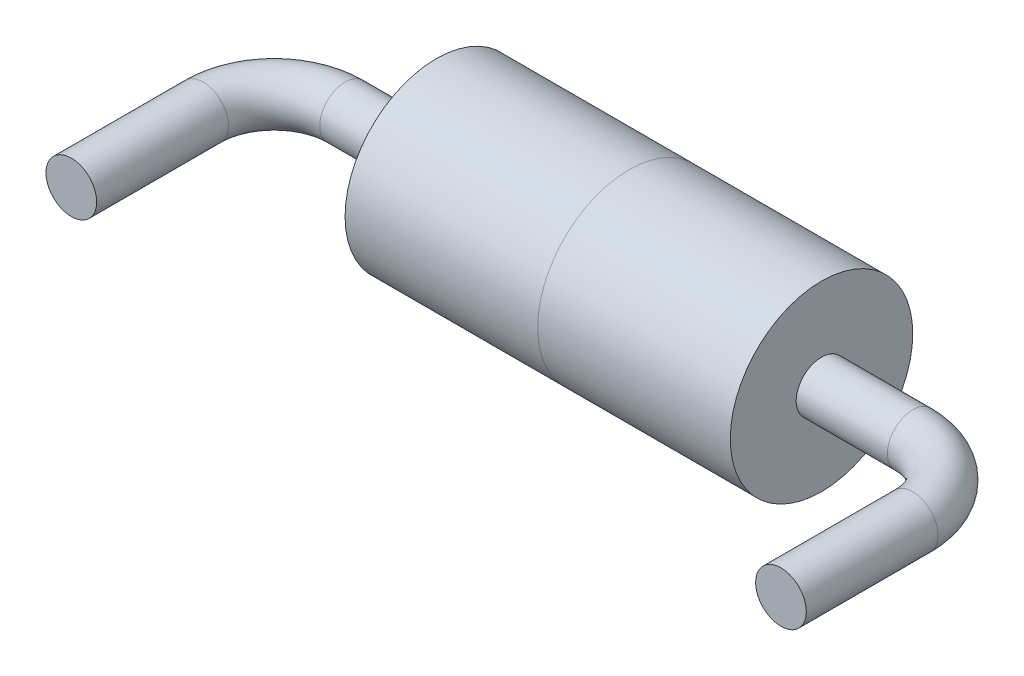
ISO-10303-21;
HEADER;
FILE_DESCRIPTION(('STEP AP214'),'2;1');
FILE_NAME('part.step','',(''),(''),'','','');
FILE_SCHEMA(('AUTOMOTIVE_DESIGN { 1 0 10303 214 1 1 1 1 }'));
ENDSEC;
DATA;
#1=APPLICATION_CONTEXT('core data for automotive mechanical design processes');
#2=APPLICATION_PROTOCOL_DEFINITION('international standard','automotive_design',2000,#1);
#3=PRODUCT_CONTEXT('',#1,'mechanical');
#4=PRODUCT('Part','Part','',(#3));
#5=PRODUCT_RELATED_PRODUCT_CATEGORY('part','',(#4));
#6=PRODUCT_DEFINITION_FORMATION('','',#4);
#7=PRODUCT_DEFINITION_CONTEXT('part definition',#1,'design');
#8=PRODUCT_DEFINITION('design','',#6,#7);
#9=PRODUCT_DEFINITION_SHAPE('','',#8);
#10=(LENGTH_UNIT() NAMED_UNIT(*) SI_UNIT(.MILLI.,.METRE.));
#11=(NAMED_UNIT(*) PLANE_ANGLE_UNIT() SI_UNIT($,.RADIAN.));
#12=(NAMED_UNIT(*) SI_UNIT($,.STERADIAN.) SOLID_ANGLE_UNIT());
#13=UNCERTAINTY_MEASURE_WITH_UNIT(LENGTH_MEASURE(1.E-05),#10,'distance_accuracy_value','');
#14=(GEOMETRIC_REPRESENTATION_CONTEXT(3) GLOBAL_UNCERTAINTY_ASSIGNED_CONTEXT((#13)) GLOBAL_UNIT_ASSIGNED_CONTEXT((#10,
#11,#12)) REPRESENTATION_CONTEXT('',''));
#15=CARTESIAN_POINT('',(0.,0.,0.));
#16=DIRECTION('',(0.,0.,1.));
#17=DIRECTION('',(1.,0.,0.));
#18=AXIS2_PLACEMENT_3D('',#15,#16,#17);
#19=CARTESIAN_POINT('',(-0.700000000000004,0.,0.));
#20=DIRECTION('',(-1.,0.,0.));
#21=DIRECTION('',(0.,0.,1.));
#22=AXIS2_PLACEMENT_3D('',#19,#20,#21);
#23=CYLINDRICAL_SURFACE('',#22,0.25);
#24=CARTESIAN_POINT('',(-6.29999999999999,0.,0.));
#25=DIRECTION('',(1.,0.,0.));
#26=DIRECTION('',(0.,0.,-1.));
#27=AXIS2_PLACEMENT_3D('',#24,#25,#26);
#28=CIRCLE('',#27,0.25);
#29=CARTESIAN_POINT('',(-6.29999999999999,0.,-0.249999999999999));
#30=VERTEX_POINT('',#29);
#31=EDGE_CURVE('E81',#30,#30,#28,.T.);
#32=ORIENTED_EDGE('',*,*,#31,.T.);
#33=EDGE_LOOP('',(#32));
#34=FACE_BOUND('',#33,.T.);
#35=CARTESIAN_POINT('',(-5.40000000000001,0.,0.));
#36=DIRECTION('',(1.,0.,0.));
#37=DIRECTION('',(0.,0.,-1.));
#38=AXIS2_PLACEMENT_3D('',#35,#36,#37);
#39=CIRCLE('',#38,0.25);
#40=CARTESIAN_POINT('',(-5.40000000000001,0.,-0.249999999999999));
#41=VERTEX_POINT('',#40);
#42=EDGE_CURVE('E11',#41,#41,#39,.T.);
#43=ORIENTED_EDGE('',*,*,#42,.F.);
#44=EDGE_LOOP('',(#43));
#45=FACE_BOUND('',#44,.T.);
#46=ADVANCED_FACE('F37',(#34,#45),#23,.T.);
#47=CARTESIAN_POINT('',(-7.,0.,2.));
#48=DIRECTION('',(0.,0.,-1.));
#49=DIRECTION('',(-1.,0.,0.));
#50=AXIS2_PLACEMENT_3D('',#47,#48,#49);
#51=PLANE('',#50);
#52=CARTESIAN_POINT('',(-7.,0.,2.));
#53=DIRECTION('',(0.,0.,-1.));
#54=DIRECTION('',(-1.,0.,0.));
#55=AXIS2_PLACEMENT_3D('',#52,#53,#54);
#56=CIRCLE('',#55,0.25);
#57=CARTESIAN_POINT('',(-7.25,0.,2.));
#58=VERTEX_POINT('',#57);
#59=EDGE_CURVE('E45',#58,#58,#56,.T.);
#60=ORIENTED_EDGE('',*,*,#59,.F.);
#61=EDGE_LOOP('',(#60));
#62=FACE_BOUND('',#61,.T.);
#63=ADVANCED_FACE('F102',(#62),#51,.F.);
#64=CARTESIAN_POINT('',(-6.3,0.,0.700000000000001));
#65=DIRECTION('',(0.,1.,0.));
#66=DIRECTION('',(0.,0.,1.));
#67=AXIS2_PLACEMENT_3D('',#64,#65,#66);
#68=TOROIDAL_SURFACE('',#67,0.7,0.25);
#69=CARTESIAN_POINT('',(-7.,0.,0.700000000000005));
#70=DIRECTION('',(0.,0.,-1.));
#71=DIRECTION('',(-1.,0.,0.));
#72=AXIS2_PLACEMENT_3D('',#69,#70,#71);
#73=CIRCLE('',#72,0.25);
#74=CARTESIAN_POINT('',(-7.25,0.,0.700000000000006));
#75=VERTEX_POINT('',#74);
#76=EDGE_CURVE('E84',#75,#75,#73,.T.);
#77=CARTESIAN_POINT('',(-6.3,0.,0.700000000000001));
#78=DIRECTION('',(0.,1.,0.));
#79=DIRECTION('',(0.,0.,1.));
#80=AXIS2_PLACEMENT_3D('',#77,#78,#79);
#81=CIRCLE('',#80,0.95);
#82=EDGE_CURVE('',#30,#75,#81,.T.);
#83=ORIENTED_EDGE('',*,*,#31,.F.);
#84=ORIENTED_EDGE('',*,*,#76,.T.);
#85=ORIENTED_EDGE('',*,*,#82,.T.);
#86=ORIENTED_EDGE('',*,*,#82,.F.);
#87=EDGE_LOOP('',(#83,#85,#84,#86));
#88=FACE_BOUND('',#87,.T.);
#89=ADVANCED_FACE('F89',(#88),#68,.T.);
#90=CARTESIAN_POINT('',(-7.,0.,0.700000000000005));
#91=DIRECTION('',(0.,0.,1.));
#92=DIRECTION('',(1.,0.,0.));
#93=AXIS2_PLACEMENT_3D('',#90,#91,#92);
#94=CYLINDRICAL_SURFACE('',#93,0.25);
#95=ORIENTED_EDGE('',*,*,#59,.T.);
#96=EDGE_LOOP('',(#95));
#97=FACE_BOUND('',#96,.T.);
#98=ORIENTED_EDGE('',*,*,#76,.F.);
#99=EDGE_LOOP('',(#98));
#100=FACE_BOUND('',#99,.T.);
#101=ADVANCED_FACE('F92',(#97,#100),#94,.T.);
#102=CARTESIAN_POINT('',(-5.4,0.,0.));
#103=DIRECTION('',(1.,0.,0.));
#104=DIRECTION('',(0.,0.,-1.));
#105=AXIS2_PLACEMENT_3D('',#102,#103,#104);
#106=PLANE('',#105);
#107=ORIENTED_EDGE('',*,*,#42,.T.);
#108=EDGE_LOOP('',(#107));
#109=FACE_BOUND('',#108,.T.);
#110=CARTESIAN_POINT('',(-5.4,0.,0.));
#111=DIRECTION('',(1.,0.,0.));
#112=DIRECTION('',(0.,0.,-1.));
#113=AXIS2_PLACEMENT_3D('',#110,#111,#112);
#114=CIRCLE('',#113,0.9);
#115=CARTESIAN_POINT('',(-5.4,0.,-0.9));
#116=VERTEX_POINT('',#115);
#117=EDGE_CURVE('E70',#116,#116,#114,.T.);
#118=ORIENTED_EDGE('',*,*,#117,.F.);
#119=EDGE_LOOP('',(#118));
#120=FACE_BOUND('',#119,.T.);
#121=ADVANCED_FACE('F94',(#109,#120),#106,.F.);
#122=CARTESIAN_POINT('',(-1.6,0.,0.));
#123=DIRECTION('',(1.,0.,0.));
#124=DIRECTION('',(0.,0.,-1.));
#125=AXIS2_PLACEMENT_3D('',#122,#123,#124);
#126=PLANE('',#125);
#127=CARTESIAN_POINT('',(-1.6,0.,0.));
#128=DIRECTION('',(1.,0.,0.));
#129=DIRECTION('',(0.,0.,-1.));
#130=AXIS2_PLACEMENT_3D('',#127,#128,#129);
#131=CIRCLE('',#130,0.25);
#132=CARTESIAN_POINT('',(-1.6,0.,-0.25));
#133=VERTEX_POINT('',#132);
#134=EDGE_CURVE('E65',#133,#133,#131,.T.);
#135=ORIENTED_EDGE('',*,*,#134,.F.);
#136=EDGE_LOOP('',(#135));
#137=FACE_BOUND('',#136,.T.);
#138=CARTESIAN_POINT('',(-1.6,0.,0.));
#139=DIRECTION('',(1.,0.,0.));
#140=DIRECTION('',(0.,0.,-1.));
#141=AXIS2_PLACEMENT_3D('',#138,#139,#140);
#142=CIRCLE('',#141,0.9);
#143=CARTESIAN_POINT('',(-1.6,0.,-0.900000000000003));
#144=VERTEX_POINT('',#143);
#145=EDGE_CURVE('E62',#144,#144,#142,.T.);
#146=ORIENTED_EDGE('',*,*,#145,.T.);
#147=EDGE_LOOP('',(#146));
#148=FACE_BOUND('',#147,.T.);
#149=ADVANCED_FACE('F63',(#137,#148),#126,.T.);
#150=CARTESIAN_POINT('',(-5.4,0.,0.));
#151=DIRECTION('',(1.,0.,0.));
#152=DIRECTION('',(0.,0.,-1.));
#153=AXIS2_PLACEMENT_3D('',#150,#151,#152);
#154=CYLINDRICAL_SURFACE('',#153,0.9);
#155=CARTESIAN_POINT('',(-3.5,0.,0.));
#156=DIRECTION('',(1.,0.,0.));
#157=DIRECTION('',(0.,0.,-1.));
#158=AXIS2_PLACEMENT_3D('',#155,#156,#157);
#159=CIRCLE('',#158,0.9);
#160=CARTESIAN_POINT('',(-3.5,0.,-0.899999999999999));
#161=VERTEX_POINT('',#160);
#162=EDGE_CURVE('E66',#161,#161,#159,.T.);
#163=ORIENTED_EDGE('',*,*,#162,.F.);
#164=EDGE_LOOP('',(#163));
#165=FACE_BOUND('',#164,.T.);
#166=ORIENTED_EDGE('',*,*,#117,.T.);
#167=EDGE_LOOP('',(#166));
#168=FACE_BOUND('',#167,.T.);
#169=ADVANCED_FACE('F138',(#165,#168),#154,.T.);
#170=CARTESIAN_POINT('',(-3.5,0.,0.));
#171=DIRECTION('',(1.,0.,0.));
#172=DIRECTION('',(0.,0.,-1.));
#173=AXIS2_PLACEMENT_3D('',#170,#171,#172);
#174=CYLINDRICAL_SURFACE('',#173,0.9);
#175=ORIENTED_EDGE('',*,*,#145,.F.);
#176=EDGE_LOOP('',(#175));
#177=FACE_BOUND('',#176,.T.);
#178=ORIENTED_EDGE('',*,*,#162,.T.);
#179=EDGE_LOOP('',(#178));
#180=FACE_BOUND('',#179,.T.);
#181=ADVANCED_FACE('F112',(#177,#180),#174,.T.);
#182=CARTESIAN_POINT('',(0.,0.,2.));
#183=DIRECTION('',(0.,0.,1.));
#184=DIRECTION('',(1.,0.,0.));
#185=AXIS2_PLACEMENT_3D('',#182,#183,#184);
#186=PLANE('',#185);
#187=CARTESIAN_POINT('',(0.,0.,2.));
#188=DIRECTION('',(0.,0.,1.));
#189=DIRECTION('',(1.,0.,0.));
#190=AXIS2_PLACEMENT_3D('',#187,#188,#189);
#191=CIRCLE('',#190,0.25);
#192=CARTESIAN_POINT('',(0.25,0.,2.));
#193=VERTEX_POINT('',#192);
#194=EDGE_CURVE('E50',#193,#193,#191,.T.);
#195=ORIENTED_EDGE('',*,*,#194,.T.);
#196=EDGE_LOOP('',(#195));
#197=FACE_BOUND('',#196,.T.);
#198=ADVANCED_FACE('F39',(#197),#186,.T.);
#199=CARTESIAN_POINT('',(0.,0.,2.));
#200=DIRECTION('',(0.,0.,-1.));
#201=DIRECTION('',(-1.,0.,0.));
#202=AXIS2_PLACEMENT_3D('',#199,#200,#201);
#203=CYLINDRICAL_SURFACE('',#202,0.25);
#204=CARTESIAN_POINT('',(0.,0.,0.700000000000006));
#205=DIRECTION('',(0.,0.,1.));
#206=DIRECTION('',(1.,0.,0.));
#207=AXIS2_PLACEMENT_3D('',#204,#205,#206);
#208=CIRCLE('',#207,0.25);
#209=CARTESIAN_POINT('',(0.250000000000014,0.,0.700000000000008));
#210=VERTEX_POINT('',#209);
#211=EDGE_CURVE('E75',#210,#210,#208,.T.);
#212=ORIENTED_EDGE('',*,*,#211,.T.);
#213=EDGE_LOOP('',(#212));
#214=FACE_BOUND('',#213,.T.);
#215=ORIENTED_EDGE('',*,*,#194,.F.);
#216=EDGE_LOOP('',(#215));
#217=FACE_BOUND('',#216,.T.);
#218=ADVANCED_FACE('F121',(#214,#217),#203,.T.);
#219=CARTESIAN_POINT('',(-0.7,0.,0.7));
#220=DIRECTION('',(0.,1.,0.));
#221=DIRECTION('',(0.,0.,1.));
#222=AXIS2_PLACEMENT_3D('',#219,#220,#221);
#223=TOROIDAL_SURFACE('',#222,0.700000000000014,0.25);
#224=CARTESIAN_POINT('',(-0.700000000000004,0.,0.));
#225=DIRECTION('',(1.,0.,0.));
#226=DIRECTION('',(0.,0.,-1.));
#227=AXIS2_PLACEMENT_3D('',#224,#225,#226);
#228=CIRCLE('',#227,0.25);
#229=CARTESIAN_POINT('',(-0.700000000000006,0.,-0.250000000000014));
#230=VERTEX_POINT('',#229);
#231=EDGE_CURVE('E78',#230,#230,#228,.T.);
#232=CARTESIAN_POINT('',(-0.7,0.,0.7));
#233=DIRECTION('',(0.,1.,0.));
#234=DIRECTION('',(0.,0.,1.));
#235=AXIS2_PLACEMENT_3D('',#232,#233,#234);
#236=CIRCLE('',#235,0.950000000000014);
#237=EDGE_CURVE('',#210,#230,#236,.T.);
#238=ORIENTED_EDGE('',*,*,#211,.F.);
#239=ORIENTED_EDGE('',*,*,#231,.T.);
#240=ORIENTED_EDGE('',*,*,#237,.T.);
#241=ORIENTED_EDGE('',*,*,#237,.F.);
#242=EDGE_LOOP('',(#238,#240,#239,#241));
#243=FACE_BOUND('',#242,.T.);
#244=ADVANCED_FACE('F116',(#243),#223,.T.);
#245=ORIENTED_EDGE('',*,*,#134,.T.);
#246=EDGE_LOOP('',(#245));
#247=FACE_BOUND('',#246,.T.);
#248=ORIENTED_EDGE('',*,*,#231,.F.);
#249=EDGE_LOOP('',(#248));
#250=FACE_BOUND('',#249,.T.);
#251=ADVANCED_FACE('F107',(#247,#250),#23,.T.);
#252=CLOSED_SHELL('',(#46,#63,#89,#101,#121,#149,#169,#181,#198,#218,#244,#251));
#253=MANIFOLD_SOLID_BREP('B2',#252);
#254=ADVANCED_BREP_SHAPE_REPRESENTATION('',(#18,#253),#14);
#255=SHAPE_DEFINITION_REPRESENTATION(#9,#254);
ENDSEC;
END-ISO-10303-21;
